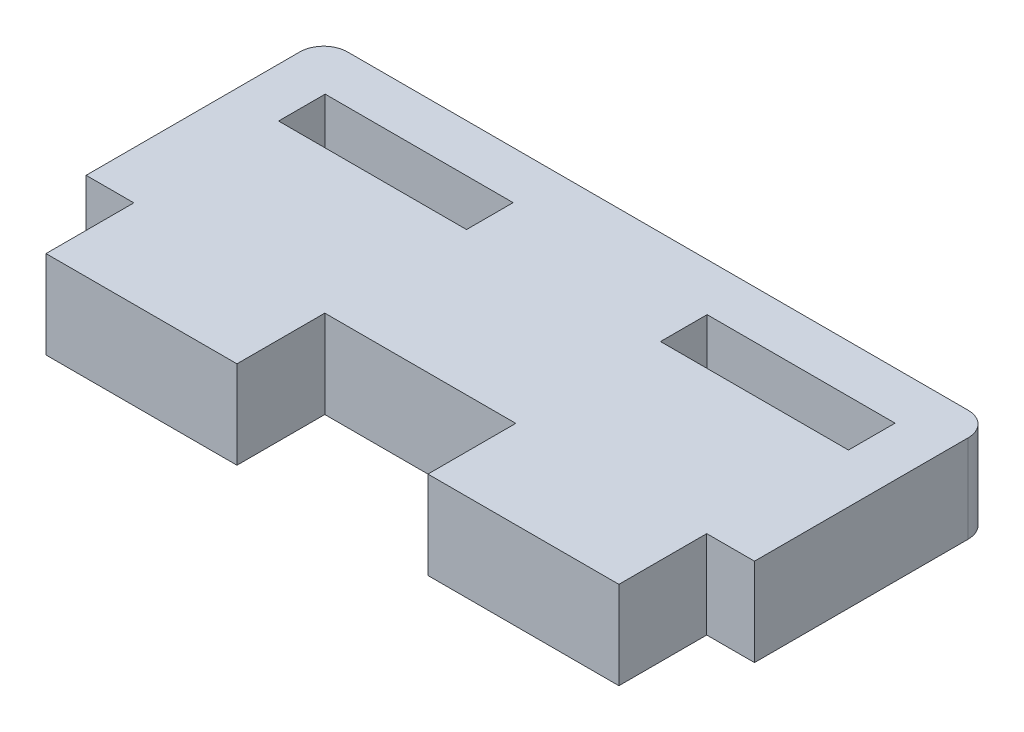
ISO-10303-21;
HEADER;
FILE_DESCRIPTION(('STEP AP214'),'2;1');
FILE_NAME('part.step','',(''),(''),'','','');
FILE_SCHEMA(('AUTOMOTIVE_DESIGN { 1 0 10303 214 1 1 1 1 }'));
ENDSEC;
DATA;
#1=APPLICATION_CONTEXT('core data for automotive mechanical design processes');
#2=APPLICATION_PROTOCOL_DEFINITION('international standard','automotive_design',2000,#1);
#3=PRODUCT_CONTEXT('',#1,'mechanical');
#4=PRODUCT('Part','Part','',(#3));
#5=PRODUCT_RELATED_PRODUCT_CATEGORY('part','',(#4));
#6=PRODUCT_DEFINITION_FORMATION('','',#4);
#7=PRODUCT_DEFINITION_CONTEXT('part definition',#1,'design');
#8=PRODUCT_DEFINITION('design','',#6,#7);
#9=PRODUCT_DEFINITION_SHAPE('','',#8);
#10=(LENGTH_UNIT() NAMED_UNIT(*) SI_UNIT(.MILLI.,.METRE.));
#11=(NAMED_UNIT(*) PLANE_ANGLE_UNIT() SI_UNIT($,.RADIAN.));
#12=(NAMED_UNIT(*) SI_UNIT($,.STERADIAN.) SOLID_ANGLE_UNIT());
#13=UNCERTAINTY_MEASURE_WITH_UNIT(LENGTH_MEASURE(1.E-05),#10,'distance_accuracy_value','');
#14=(GEOMETRIC_REPRESENTATION_CONTEXT(3) GLOBAL_UNCERTAINTY_ASSIGNED_CONTEXT((#13)) GLOBAL_UNIT_ASSIGNED_CONTEXT((#10,
#11,#12)) REPRESENTATION_CONTEXT('',''));
#15=CARTESIAN_POINT('',(0.,0.,0.));
#16=DIRECTION('',(0.,0.,1.));
#17=DIRECTION('',(1.,0.,0.));
#18=AXIS2_PLACEMENT_3D('',#15,#16,#17);
#19=CARTESIAN_POINT('',(0.,5.842,0.));
#20=DIRECTION('',(0.,1.,0.));
#21=DIRECTION('',(0.,0.,1.));
#22=AXIS2_PLACEMENT_3D('',#19,#20,#21);
#23=PLANE('',#22);
#24=DIRECTION('',(0.,0.,-1.));
#25=VECTOR('',#24,1.);
#26=CARTESIAN_POINT('',(22.225,5.842,4.7625));
#27=LINE('',#26,#25);
#28=CARTESIAN_POINT('',(22.225,5.842,4.7625));
#29=VERTEX_POINT('',#28);
#30=CARTESIAN_POINT('',(22.225,5.842,-9.4488));
#31=VERTEX_POINT('',#30);
#32=EDGE_CURVE('E281',#29,#31,#27,.T.);
#33=ORIENTED_EDGE('',*,*,#32,.T.);
#34=CARTESIAN_POINT('',(20.6375,5.842,-9.44880000000001));
#35=DIRECTION('',(0.,1.,0.));
#36=DIRECTION('',(0.,0.,1.));
#37=AXIS2_PLACEMENT_3D('',#34,#35,#36);
#38=CIRCLE('',#37,1.5875);
#39=CARTESIAN_POINT('',(20.6375,5.842,-11.0363));
#40=VERTEX_POINT('',#39);
#41=EDGE_CURVE('E43',#31,#40,#38,.T.);
#42=ORIENTED_EDGE('',*,*,#41,.T.);
#43=DIRECTION('',(-1.,0.,0.));
#44=VECTOR('',#43,1.);
#45=CARTESIAN_POINT('',(22.225,5.842,-11.0363));
#46=LINE('',#45,#44);
#47=CARTESIAN_POINT('',(-20.6375,5.842,-11.0363));
#48=VERTEX_POINT('',#47);
#49=EDGE_CURVE('E283',#40,#48,#46,.T.);
#50=ORIENTED_EDGE('',*,*,#49,.T.);
#51=CARTESIAN_POINT('',(-20.6375,5.842,-9.4488));
#52=DIRECTION('',(0.,1.,0.));
#53=DIRECTION('',(0.,0.,1.));
#54=AXIS2_PLACEMENT_3D('',#51,#52,#53);
#55=CIRCLE('',#54,1.5875);
#56=CARTESIAN_POINT('',(-22.225,5.842,-9.4488));
#57=VERTEX_POINT('',#56);
#58=EDGE_CURVE('E50',#48,#57,#55,.T.);
#59=ORIENTED_EDGE('',*,*,#58,.T.);
#60=DIRECTION('',(0.,0.,1.));
#61=VECTOR('',#60,1.);
#62=CARTESIAN_POINT('',(-22.225,5.842,-4.7625));
#63=LINE('',#62,#61);
#64=CARTESIAN_POINT('',(-22.225,5.842,4.7625));
#65=VERTEX_POINT('',#64);
#66=EDGE_CURVE('E260',#57,#65,#63,.T.);
#67=ORIENTED_EDGE('',*,*,#66,.T.);
#68=DIRECTION('',(1.,0.,0.));
#69=VECTOR('',#68,1.);
#70=CARTESIAN_POINT('',(-19.05,5.842,4.7625));
#71=LINE('',#70,#69);
#72=CARTESIAN_POINT('',(-19.05,5.842,4.7625));
#73=VERTEX_POINT('',#72);
#74=EDGE_CURVE('E262',#65,#73,#71,.T.);
#75=ORIENTED_EDGE('',*,*,#74,.T.);
#76=DIRECTION('',(0.,0.,1.));
#77=VECTOR('',#76,1.);
#78=CARTESIAN_POINT('',(-19.05,5.842,10.6045));
#79=LINE('',#78,#77);
#80=CARTESIAN_POINT('',(-19.05,5.842,10.6045));
#81=VERTEX_POINT('',#80);
#82=EDGE_CURVE('E265',#73,#81,#79,.T.);
#83=ORIENTED_EDGE('',*,*,#82,.T.);
#84=DIRECTION('',(1.,0.,0.));
#85=VECTOR('',#84,1.);
#86=CARTESIAN_POINT('',(-6.35,5.842,10.6045));
#87=LINE('',#86,#85);
#88=CARTESIAN_POINT('',(-6.35,5.842,10.6045));
#89=VERTEX_POINT('',#88);
#90=EDGE_CURVE('E267',#81,#89,#87,.T.);
#91=ORIENTED_EDGE('',*,*,#90,.T.);
#92=DIRECTION('',(0.,0.,-1.));
#93=VECTOR('',#92,1.);
#94=CARTESIAN_POINT('',(-6.35,5.842,10.6045));
#95=LINE('',#94,#93);
#96=CARTESIAN_POINT('',(-6.35,5.842,4.7625));
#97=VERTEX_POINT('',#96);
#98=EDGE_CURVE('E269',#89,#97,#95,.T.);
#99=ORIENTED_EDGE('',*,*,#98,.T.);
#100=DIRECTION('',(1.,0.,0.));
#101=VECTOR('',#100,1.);
#102=CARTESIAN_POINT('',(6.35,5.842,4.7625));
#103=LINE('',#102,#101);
#104=CARTESIAN_POINT('',(6.35,5.842,4.7625));
#105=VERTEX_POINT('',#104);
#106=EDGE_CURVE('E271',#97,#105,#103,.T.);
#107=ORIENTED_EDGE('',*,*,#106,.T.);
#108=DIRECTION('',(0.,0.,1.));
#109=VECTOR('',#108,1.);
#110=CARTESIAN_POINT('',(6.35,5.842,10.6045));
#111=LINE('',#110,#109);
#112=CARTESIAN_POINT('',(6.35,5.842,10.6045));
#113=VERTEX_POINT('',#112);
#114=EDGE_CURVE('E273',#105,#113,#111,.T.);
#115=ORIENTED_EDGE('',*,*,#114,.T.);
#116=DIRECTION('',(1.,0.,0.));
#117=VECTOR('',#116,1.);
#118=CARTESIAN_POINT('',(6.35,5.842,10.6045));
#119=LINE('',#118,#117);
#120=CARTESIAN_POINT('',(19.05,5.842,10.6045));
#121=VERTEX_POINT('',#120);
#122=EDGE_CURVE('E275',#113,#121,#119,.T.);
#123=ORIENTED_EDGE('',*,*,#122,.T.);
#124=DIRECTION('',(0.,0.,-1.));
#125=VECTOR('',#124,1.);
#126=CARTESIAN_POINT('',(19.05,5.842,10.6045));
#127=LINE('',#126,#125);
#128=CARTESIAN_POINT('',(19.05,5.842,4.7625));
#129=VERTEX_POINT('',#128);
#130=EDGE_CURVE('E277',#121,#129,#127,.T.);
#131=ORIENTED_EDGE('',*,*,#130,.T.);
#132=DIRECTION('',(1.,0.,0.));
#133=VECTOR('',#132,1.);
#134=CARTESIAN_POINT('',(22.225,5.842,4.7625));
#135=LINE('',#134,#133);
#136=EDGE_CURVE('E279',#129,#29,#135,.T.);
#137=ORIENTED_EDGE('',*,*,#136,.T.);
#138=EDGE_LOOP('',(#33,#42,#50,#59,#67,#75,#83,#91,#99,#107,#115,#123,#131,#137));
#139=FACE_BOUND('',#138,.T.);
#140=DIRECTION('',(0.,0.,-1.));
#141=VECTOR('',#140,1.);
#142=CARTESIAN_POINT('',(-6.45,5.842,-7.8613));
#143=LINE('',#142,#141);
#144=CARTESIAN_POINT('',(-6.45,5.842,-4.7625));
#145=VERTEX_POINT('',#144);
#146=CARTESIAN_POINT('',(-6.45,5.842,-7.8613));
#147=VERTEX_POINT('',#146);
#148=EDGE_CURVE('E231',#145,#147,#143,.T.);
#149=ORIENTED_EDGE('',*,*,#148,.F.);
#150=DIRECTION('',(1.,0.,0.));
#151=VECTOR('',#150,1.);
#152=CARTESIAN_POINT('',(-6.45,5.842,-4.7625));
#153=LINE('',#152,#151);
#154=CARTESIAN_POINT('',(-18.95,5.842,-4.7625));
#155=VERTEX_POINT('',#154);
#156=EDGE_CURVE('E229',#155,#145,#153,.T.);
#157=ORIENTED_EDGE('',*,*,#156,.F.);
#158=DIRECTION('',(0.,0.,1.));
#159=VECTOR('',#158,1.);
#160=CARTESIAN_POINT('',(-18.95,5.842,-4.7625));
#161=LINE('',#160,#159);
#162=CARTESIAN_POINT('',(-18.95,5.842,-7.8613));
#163=VERTEX_POINT('',#162);
#164=EDGE_CURVE('E237',#163,#155,#161,.T.);
#165=ORIENTED_EDGE('',*,*,#164,.F.);
#166=DIRECTION('',(-1.,0.,0.));
#167=VECTOR('',#166,1.);
#168=CARTESIAN_POINT('',(-6.45,5.842,-7.8613));
#169=LINE('',#168,#167);
#170=EDGE_CURVE('E234',#147,#163,#169,.T.);
#171=ORIENTED_EDGE('',*,*,#170,.F.);
#172=EDGE_LOOP('',(#149,#157,#165,#171));
#173=FACE_BOUND('',#172,.T.);
#174=DIRECTION('',(0.,0.,1.));
#175=VECTOR('',#174,1.);
#176=CARTESIAN_POINT('',(6.45,5.842,-7.8613));
#177=LINE('',#176,#175);
#178=CARTESIAN_POINT('',(6.45,5.842,-7.8613));
#179=VERTEX_POINT('',#178);
#180=CARTESIAN_POINT('',(6.45,5.842,-4.7625));
#181=VERTEX_POINT('',#180);
#182=EDGE_CURVE('E198',#179,#181,#177,.T.);
#183=ORIENTED_EDGE('',*,*,#182,.F.);
#184=DIRECTION('',(-1.,0.,0.));
#185=VECTOR('',#184,1.);
#186=CARTESIAN_POINT('',(18.95,5.842,-7.8613));
#187=LINE('',#186,#185);
#188=CARTESIAN_POINT('',(18.95,5.842,-7.8613));
#189=VERTEX_POINT('',#188);
#190=EDGE_CURVE('E188',#189,#179,#187,.T.);
#191=ORIENTED_EDGE('',*,*,#190,.F.);
#192=DIRECTION('',(0.,0.,-1.));
#193=VECTOR('',#192,1.);
#194=CARTESIAN_POINT('',(18.95,5.842,-4.7625));
#195=LINE('',#194,#193);
#196=CARTESIAN_POINT('',(18.95,5.842,-4.7625));
#197=VERTEX_POINT('',#196);
#198=EDGE_CURVE('E213',#197,#189,#195,.T.);
#199=ORIENTED_EDGE('',*,*,#198,.F.);
#200=DIRECTION('',(1.,0.,0.));
#201=VECTOR('',#200,1.);
#202=CARTESIAN_POINT('',(18.95,5.842,-4.7625));
#203=LINE('',#202,#201);
#204=EDGE_CURVE('E211',#181,#197,#203,.T.);
#205=ORIENTED_EDGE('',*,*,#204,.F.);
#206=EDGE_LOOP('',(#183,#191,#199,#205));
#207=FACE_BOUND('',#206,.T.);
#208=ADVANCED_FACE('F35',(#139,#173,#207),#23,.T.);
#209=CARTESIAN_POINT('',(0.,0.,0.));
#210=DIRECTION('',(0.,1.,0.));
#211=DIRECTION('',(0.,0.,1.));
#212=AXIS2_PLACEMENT_3D('',#209,#210,#211);
#213=PLANE('',#212);
#214=DIRECTION('',(1.,0.,0.));
#215=VECTOR('',#214,1.);
#216=CARTESIAN_POINT('',(-6.45,0.,-4.7625));
#217=LINE('',#216,#215);
#218=CARTESIAN_POINT('',(-18.95,0.,-4.7625));
#219=VERTEX_POINT('',#218);
#220=CARTESIAN_POINT('',(-6.45,0.,-4.7625));
#221=VERTEX_POINT('',#220);
#222=EDGE_CURVE('E206',#219,#221,#217,.T.);
#223=ORIENTED_EDGE('',*,*,#222,.T.);
#224=DIRECTION('',(0.,0.,-1.));
#225=VECTOR('',#224,1.);
#226=CARTESIAN_POINT('',(-6.45,0.,-7.8613));
#227=LINE('',#226,#225);
#228=CARTESIAN_POINT('',(-6.45,0.,-7.8613));
#229=VERTEX_POINT('',#228);
#230=EDGE_CURVE('E242',#221,#229,#227,.T.);
#231=ORIENTED_EDGE('',*,*,#230,.T.);
#232=DIRECTION('',(-1.,0.,0.));
#233=VECTOR('',#232,1.);
#234=CARTESIAN_POINT('',(-6.45,0.,-7.8613));
#235=LINE('',#234,#233);
#236=CARTESIAN_POINT('',(-18.95,0.,-7.8613));
#237=VERTEX_POINT('',#236);
#238=EDGE_CURVE('E245',#229,#237,#235,.T.);
#239=ORIENTED_EDGE('',*,*,#238,.T.);
#240=DIRECTION('',(0.,0.,1.));
#241=VECTOR('',#240,1.);
#242=CARTESIAN_POINT('',(-18.95,0.,-4.7625));
#243=LINE('',#242,#241);
#244=EDGE_CURVE('E232',#237,#219,#243,.T.);
#245=ORIENTED_EDGE('',*,*,#244,.T.);
#246=EDGE_LOOP('',(#223,#231,#239,#245));
#247=FACE_BOUND('',#246,.T.);
#248=DIRECTION('',(-1.,0.,0.));
#249=VECTOR('',#248,1.);
#250=CARTESIAN_POINT('',(22.225,0.,-11.0363));
#251=LINE('',#250,#249);
#252=CARTESIAN_POINT('',(20.6375,0.,-11.0363));
#253=VERTEX_POINT('',#252);
#254=CARTESIAN_POINT('',(-20.6375,0.,-11.0363));
#255=VERTEX_POINT('',#254);
#256=EDGE_CURVE('E306',#253,#255,#251,.T.);
#257=ORIENTED_EDGE('',*,*,#256,.F.);
#258=CARTESIAN_POINT('',(20.6375,0.,-9.44880000000001));
#259=DIRECTION('',(0.,1.,0.));
#260=DIRECTION('',(0.,0.,1.));
#261=AXIS2_PLACEMENT_3D('',#258,#259,#260);
#262=CIRCLE('',#261,1.5875);
#263=CARTESIAN_POINT('',(22.225,0.,-9.44880000000001));
#264=VERTEX_POINT('',#263);
#265=EDGE_CURVE('E346',#253,#264,#262,.F.);
#266=ORIENTED_EDGE('',*,*,#265,.T.);
#267=DIRECTION('',(0.,0.,-1.));
#268=VECTOR('',#267,1.);
#269=CARTESIAN_POINT('',(22.225,0.,-11.0363));
#270=LINE('',#269,#268);
#271=CARTESIAN_POINT('',(22.225,0.,4.7625));
#272=VERTEX_POINT('',#271);
#273=EDGE_CURVE('E304',#272,#264,#270,.T.);
#274=ORIENTED_EDGE('',*,*,#273,.F.);
#275=DIRECTION('',(1.,0.,0.));
#276=VECTOR('',#275,1.);
#277=CARTESIAN_POINT('',(22.225,0.,4.7625));
#278=LINE('',#277,#276);
#279=CARTESIAN_POINT('',(19.05,0.,4.7625));
#280=VERTEX_POINT('',#279);
#281=EDGE_CURVE('E301',#280,#272,#278,.T.);
#282=ORIENTED_EDGE('',*,*,#281,.F.);
#283=DIRECTION('',(0.,0.,-1.));
#284=VECTOR('',#283,1.);
#285=CARTESIAN_POINT('',(19.05,0.,10.6045));
#286=LINE('',#285,#284);
#287=CARTESIAN_POINT('',(19.05,0.,10.6045));
#288=VERTEX_POINT('',#287);
#289=EDGE_CURVE('E299',#288,#280,#286,.T.);
#290=ORIENTED_EDGE('',*,*,#289,.F.);
#291=DIRECTION('',(1.,0.,0.));
#292=VECTOR('',#291,1.);
#293=CARTESIAN_POINT('',(6.35,0.,10.6045));
#294=LINE('',#293,#292);
#295=CARTESIAN_POINT('',(6.35,0.,10.6045));
#296=VERTEX_POINT('',#295);
#297=EDGE_CURVE('E297',#296,#288,#294,.T.);
#298=ORIENTED_EDGE('',*,*,#297,.F.);
#299=DIRECTION('',(0.,0.,1.));
#300=VECTOR('',#299,1.);
#301=CARTESIAN_POINT('',(6.35,0.,10.6045));
#302=LINE('',#301,#300);
#303=CARTESIAN_POINT('',(6.35,0.,4.7625));
#304=VERTEX_POINT('',#303);
#305=EDGE_CURVE('E295',#304,#296,#302,.T.);
#306=ORIENTED_EDGE('',*,*,#305,.F.);
#307=DIRECTION('',(1.,0.,0.));
#308=VECTOR('',#307,1.);
#309=CARTESIAN_POINT('',(6.35,0.,4.7625));
#310=LINE('',#309,#308);
#311=CARTESIAN_POINT('',(-6.35,0.,4.7625));
#312=VERTEX_POINT('',#311);
#313=EDGE_CURVE('E293',#312,#304,#310,.T.);
#314=ORIENTED_EDGE('',*,*,#313,.F.);
#315=DIRECTION('',(0.,0.,-1.));
#316=VECTOR('',#315,1.);
#317=CARTESIAN_POINT('',(-6.35,0.,10.6045));
#318=LINE('',#317,#316);
#319=CARTESIAN_POINT('',(-6.35,0.,10.6045));
#320=VERTEX_POINT('',#319);
#321=EDGE_CURVE('E291',#320,#312,#318,.T.);
#322=ORIENTED_EDGE('',*,*,#321,.F.);
#323=DIRECTION('',(1.,0.,0.));
#324=VECTOR('',#323,1.);
#325=CARTESIAN_POINT('',(-6.35,0.,10.6045));
#326=LINE('',#325,#324);
#327=CARTESIAN_POINT('',(-19.05,0.,10.6045));
#328=VERTEX_POINT('',#327);
#329=EDGE_CURVE('E289',#328,#320,#326,.T.);
#330=ORIENTED_EDGE('',*,*,#329,.F.);
#331=DIRECTION('',(0.,0.,1.));
#332=VECTOR('',#331,1.);
#333=CARTESIAN_POINT('',(-19.05,0.,10.6045));
#334=LINE('',#333,#332);
#335=CARTESIAN_POINT('',(-19.05,0.,4.7625));
#336=VERTEX_POINT('',#335);
#337=EDGE_CURVE('E287',#336,#328,#334,.T.);
#338=ORIENTED_EDGE('',*,*,#337,.F.);
#339=DIRECTION('',(1.,0.,0.));
#340=VECTOR('',#339,1.);
#341=CARTESIAN_POINT('',(-19.05,0.,4.7625));
#342=LINE('',#341,#340);
#343=CARTESIAN_POINT('',(-22.225,0.,4.7625));
#344=VERTEX_POINT('',#343);
#345=EDGE_CURVE('E259',#344,#336,#342,.T.);
#346=ORIENTED_EDGE('',*,*,#345,.F.);
#347=DIRECTION('',(0.,0.,1.));
#348=VECTOR('',#347,1.);
#349=CARTESIAN_POINT('',(-22.225,0.,-11.0363));
#350=LINE('',#349,#348);
#351=CARTESIAN_POINT('',(-22.225,0.,-9.4488));
#352=VERTEX_POINT('',#351);
#353=EDGE_CURVE('E263',#352,#344,#350,.T.);
#354=ORIENTED_EDGE('',*,*,#353,.F.);
#355=CARTESIAN_POINT('',(-20.6375,0.,-9.4488));
#356=DIRECTION('',(0.,1.,0.));
#357=DIRECTION('',(0.,0.,1.));
#358=AXIS2_PLACEMENT_3D('',#355,#356,#357);
#359=CIRCLE('',#358,1.5875);
#360=EDGE_CURVE('E344',#352,#255,#359,.F.);
#361=ORIENTED_EDGE('',*,*,#360,.T.);
#362=EDGE_LOOP('',(#257,#266,#274,#282,#290,#298,#306,#314,#322,#330,#338,#346,#354,#361));
#363=FACE_BOUND('',#362,.T.);
#364=DIRECTION('',(-1.,0.,0.));
#365=VECTOR('',#364,1.);
#366=CARTESIAN_POINT('',(18.95,0.,-7.8613));
#367=LINE('',#366,#365);
#368=CARTESIAN_POINT('',(18.95,0.,-7.8613));
#369=VERTEX_POINT('',#368);
#370=CARTESIAN_POINT('',(6.45,0.,-7.8613));
#371=VERTEX_POINT('',#370);
#372=EDGE_CURVE('E217',#369,#371,#367,.T.);
#373=ORIENTED_EDGE('',*,*,#372,.T.);
#374=DIRECTION('',(0.,0.,1.));
#375=VECTOR('',#374,1.);
#376=CARTESIAN_POINT('',(6.45,0.,-7.8613));
#377=LINE('',#376,#375);
#378=CARTESIAN_POINT('',(6.45,0.,-4.7625));
#379=VERTEX_POINT('',#378);
#380=EDGE_CURVE('E205',#371,#379,#377,.T.);
#381=ORIENTED_EDGE('',*,*,#380,.T.);
#382=DIRECTION('',(1.,0.,0.));
#383=VECTOR('',#382,1.);
#384=CARTESIAN_POINT('',(18.95,0.,-4.7625));
#385=LINE('',#384,#383);
#386=CARTESIAN_POINT('',(18.95,0.,-4.7625));
#387=VERTEX_POINT('',#386);
#388=EDGE_CURVE('E220',#379,#387,#385,.T.);
#389=ORIENTED_EDGE('',*,*,#388,.T.);
#390=DIRECTION('',(0.,0.,-1.));
#391=VECTOR('',#390,1.);
#392=CARTESIAN_POINT('',(18.95,0.,-4.7625));
#393=LINE('',#392,#391);
#394=EDGE_CURVE('E199',#387,#369,#393,.T.);
#395=ORIENTED_EDGE('',*,*,#394,.T.);
#396=EDGE_LOOP('',(#373,#381,#389,#395));
#397=FACE_BOUND('',#396,.T.);
#398=ADVANCED_FACE('F360',(#247,#363,#397),#213,.F.);
#399=CARTESIAN_POINT('',(-19.05,5.842,4.7625));
#400=DIRECTION('',(0.,0.,-1.));
#401=DIRECTION('',(-1.,0.,0.));
#402=AXIS2_PLACEMENT_3D('',#399,#400,#401);
#403=PLANE('',#402);
#404=ORIENTED_EDGE('',*,*,#345,.T.);
#405=DIRECTION('',(0.,-1.,0.));
#406=VECTOR('',#405,1.);
#407=CARTESIAN_POINT('',(-19.05,5.842,4.7625));
#408=LINE('',#407,#406);
#409=EDGE_CURVE('E333',#73,#336,#408,.T.);
#410=ORIENTED_EDGE('',*,*,#409,.F.);
#411=ORIENTED_EDGE('',*,*,#74,.F.);
#412=DIRECTION('',(0.,-1.,0.));
#413=VECTOR('',#412,1.);
#414=CARTESIAN_POINT('',(-22.225,5.842,4.7625));
#415=LINE('',#414,#413);
#416=EDGE_CURVE('E336',#65,#344,#415,.T.);
#417=ORIENTED_EDGE('',*,*,#416,.T.);
#418=EDGE_LOOP('',(#404,#410,#411,#417));
#419=FACE_BOUND('',#418,.T.);
#420=ADVANCED_FACE('F408',(#419),#403,.F.);
#421=CARTESIAN_POINT('',(-19.05,5.842,10.6045));
#422=DIRECTION('',(1.,0.,0.));
#423=DIRECTION('',(0.,0.,-1.));
#424=AXIS2_PLACEMENT_3D('',#421,#422,#423);
#425=PLANE('',#424);
#426=ORIENTED_EDGE('',*,*,#337,.T.);
#427=DIRECTION('',(0.,-1.,0.));
#428=VECTOR('',#427,1.);
#429=CARTESIAN_POINT('',(-19.05,5.842,10.6045));
#430=LINE('',#429,#428);
#431=EDGE_CURVE('E330',#81,#328,#430,.T.);
#432=ORIENTED_EDGE('',*,*,#431,.F.);
#433=ORIENTED_EDGE('',*,*,#82,.F.);
#434=ORIENTED_EDGE('',*,*,#409,.T.);
#435=EDGE_LOOP('',(#426,#432,#433,#434));
#436=FACE_BOUND('',#435,.T.);
#437=ADVANCED_FACE('F403',(#436),#425,.F.);
#438=CARTESIAN_POINT('',(-6.35,5.842,10.6045));
#439=DIRECTION('',(0.,0.,-1.));
#440=DIRECTION('',(-1.,0.,0.));
#441=AXIS2_PLACEMENT_3D('',#438,#439,#440);
#442=PLANE('',#441);
#443=ORIENTED_EDGE('',*,*,#329,.T.);
#444=DIRECTION('',(0.,-1.,0.));
#445=VECTOR('',#444,1.);
#446=CARTESIAN_POINT('',(-6.35,5.842,10.6045));
#447=LINE('',#446,#445);
#448=EDGE_CURVE('E327',#89,#320,#447,.T.);
#449=ORIENTED_EDGE('',*,*,#448,.F.);
#450=ORIENTED_EDGE('',*,*,#90,.F.);
#451=ORIENTED_EDGE('',*,*,#431,.T.);
#452=EDGE_LOOP('',(#443,#449,#450,#451));
#453=FACE_BOUND('',#452,.T.);
#454=ADVANCED_FACE('F397',(#453),#442,.F.);
#455=CARTESIAN_POINT('',(-6.35,5.842,10.6045));
#456=DIRECTION('',(-1.,0.,0.));
#457=DIRECTION('',(0.,0.,1.));
#458=AXIS2_PLACEMENT_3D('',#455,#456,#457);
#459=PLANE('',#458);
#460=ORIENTED_EDGE('',*,*,#321,.T.);
#461=DIRECTION('',(0.,-1.,0.));
#462=VECTOR('',#461,1.);
#463=CARTESIAN_POINT('',(-6.35,5.842,4.7625));
#464=LINE('',#463,#462);
#465=EDGE_CURVE('E324',#97,#312,#464,.T.);
#466=ORIENTED_EDGE('',*,*,#465,.F.);
#467=ORIENTED_EDGE('',*,*,#98,.F.);
#468=ORIENTED_EDGE('',*,*,#448,.T.);
#469=EDGE_LOOP('',(#460,#466,#467,#468));
#470=FACE_BOUND('',#469,.T.);
#471=ADVANCED_FACE('F393',(#470),#459,.F.);
#472=CARTESIAN_POINT('',(6.35,5.842,4.7625));
#473=DIRECTION('',(0.,0.,-1.));
#474=DIRECTION('',(-1.,0.,0.));
#475=AXIS2_PLACEMENT_3D('',#472,#473,#474);
#476=PLANE('',#475);
#477=ORIENTED_EDGE('',*,*,#313,.T.);
#478=DIRECTION('',(0.,-1.,0.));
#479=VECTOR('',#478,1.);
#480=CARTESIAN_POINT('',(6.35,5.842,4.7625));
#481=LINE('',#480,#479);
#482=EDGE_CURVE('E321',#105,#304,#481,.T.);
#483=ORIENTED_EDGE('',*,*,#482,.F.);
#484=ORIENTED_EDGE('',*,*,#106,.F.);
#485=ORIENTED_EDGE('',*,*,#465,.T.);
#486=EDGE_LOOP('',(#477,#483,#484,#485));
#487=FACE_BOUND('',#486,.T.);
#488=ADVANCED_FACE('F388',(#487),#476,.F.);
#489=CARTESIAN_POINT('',(6.35,5.842,10.6045));
#490=DIRECTION('',(1.,0.,0.));
#491=DIRECTION('',(0.,0.,-1.));
#492=AXIS2_PLACEMENT_3D('',#489,#490,#491);
#493=PLANE('',#492);
#494=ORIENTED_EDGE('',*,*,#305,.T.);
#495=DIRECTION('',(0.,-1.,0.));
#496=VECTOR('',#495,1.);
#497=CARTESIAN_POINT('',(6.35,5.842,10.6045));
#498=LINE('',#497,#496);
#499=EDGE_CURVE('E318',#113,#296,#498,.T.);
#500=ORIENTED_EDGE('',*,*,#499,.F.);
#501=ORIENTED_EDGE('',*,*,#114,.F.);
#502=ORIENTED_EDGE('',*,*,#482,.T.);
#503=EDGE_LOOP('',(#494,#500,#501,#502));
#504=FACE_BOUND('',#503,.T.);
#505=ADVANCED_FACE('F382',(#504),#493,.F.);
#506=CARTESIAN_POINT('',(6.35,5.842,10.6045));
#507=DIRECTION('',(0.,0.,-1.));
#508=DIRECTION('',(-1.,0.,0.));
#509=AXIS2_PLACEMENT_3D('',#506,#507,#508);
#510=PLANE('',#509);
#511=ORIENTED_EDGE('',*,*,#297,.T.);
#512=DIRECTION('',(0.,-1.,0.));
#513=VECTOR('',#512,1.);
#514=CARTESIAN_POINT('',(19.05,5.842,10.6045));
#515=LINE('',#514,#513);
#516=EDGE_CURVE('E315',#121,#288,#515,.T.);
#517=ORIENTED_EDGE('',*,*,#516,.F.);
#518=ORIENTED_EDGE('',*,*,#122,.F.);
#519=ORIENTED_EDGE('',*,*,#499,.T.);
#520=EDGE_LOOP('',(#511,#517,#518,#519));
#521=FACE_BOUND('',#520,.T.);
#522=ADVANCED_FACE('F378',(#521),#510,.F.);
#523=CARTESIAN_POINT('',(19.05,5.842,10.6045));
#524=DIRECTION('',(-1.,0.,0.));
#525=DIRECTION('',(0.,0.,1.));
#526=AXIS2_PLACEMENT_3D('',#523,#524,#525);
#527=PLANE('',#526);
#528=ORIENTED_EDGE('',*,*,#289,.T.);
#529=DIRECTION('',(0.,-1.,0.));
#530=VECTOR('',#529,1.);
#531=CARTESIAN_POINT('',(19.05,5.842,4.7625));
#532=LINE('',#531,#530);
#533=EDGE_CURVE('E312',#129,#280,#532,.T.);
#534=ORIENTED_EDGE('',*,*,#533,.F.);
#535=ORIENTED_EDGE('',*,*,#130,.F.);
#536=ORIENTED_EDGE('',*,*,#516,.T.);
#537=EDGE_LOOP('',(#528,#534,#535,#536));
#538=FACE_BOUND('',#537,.T.);
#539=ADVANCED_FACE('F373',(#538),#527,.F.);
#540=CARTESIAN_POINT('',(22.225,5.842,4.7625));
#541=DIRECTION('',(0.,0.,-1.));
#542=DIRECTION('',(-1.,0.,0.));
#543=AXIS2_PLACEMENT_3D('',#540,#541,#542);
#544=PLANE('',#543);
#545=ORIENTED_EDGE('',*,*,#281,.T.);
#546=DIRECTION('',(0.,-1.,0.));
#547=VECTOR('',#546,1.);
#548=CARTESIAN_POINT('',(22.225,5.842,4.7625));
#549=LINE('',#548,#547);
#550=EDGE_CURVE('E285',#29,#272,#549,.T.);
#551=ORIENTED_EDGE('',*,*,#550,.F.);
#552=ORIENTED_EDGE('',*,*,#136,.F.);
#553=ORIENTED_EDGE('',*,*,#533,.T.);
#554=EDGE_LOOP('',(#545,#551,#552,#553));
#555=FACE_BOUND('',#554,.T.);
#556=ADVANCED_FACE('F367',(#555),#544,.F.);
#557=CARTESIAN_POINT('',(22.225,5.842,-11.0363));
#558=DIRECTION('',(-1.,0.,0.));
#559=DIRECTION('',(0.,0.,1.));
#560=AXIS2_PLACEMENT_3D('',#557,#558,#559);
#561=PLANE('',#560);
#562=ORIENTED_EDGE('',*,*,#273,.T.);
#563=DIRECTION('',(0.,-1.,0.));
#564=VECTOR('',#563,1.);
#565=CARTESIAN_POINT('',(22.225,5.842,-9.44880000000001));
#566=LINE('',#565,#564);
#567=EDGE_CURVE('E58',#264,#31,#566,.F.);
#568=ORIENTED_EDGE('',*,*,#567,.T.);
#569=ORIENTED_EDGE('',*,*,#32,.F.);
#570=ORIENTED_EDGE('',*,*,#550,.T.);
#571=EDGE_LOOP('',(#562,#568,#569,#570));
#572=FACE_BOUND('',#571,.T.);
#573=ADVANCED_FACE('F363',(#572),#561,.F.);
#574=CARTESIAN_POINT('',(22.225,5.842,-11.0363));
#575=DIRECTION('',(0.,0.,1.));
#576=DIRECTION('',(1.,0.,0.));
#577=AXIS2_PLACEMENT_3D('',#574,#575,#576);
#578=PLANE('',#577);
#579=ORIENTED_EDGE('',*,*,#49,.F.);
#580=DIRECTION('',(0.,-1.,0.));
#581=VECTOR('',#580,1.);
#582=CARTESIAN_POINT('',(20.6375,5.842,-11.0363));
#583=LINE('',#582,#581);
#584=EDGE_CURVE('E341',#40,#253,#583,.T.);
#585=ORIENTED_EDGE('',*,*,#584,.T.);
#586=ORIENTED_EDGE('',*,*,#256,.T.);
#587=DIRECTION('',(0.,-1.,0.));
#588=VECTOR('',#587,1.);
#589=CARTESIAN_POINT('',(-20.6375,5.842,-11.0363));
#590=LINE('',#589,#588);
#591=EDGE_CURVE('E339',#255,#48,#590,.F.);
#592=ORIENTED_EDGE('',*,*,#591,.T.);
#593=EDGE_LOOP('',(#579,#585,#586,#592));
#594=FACE_BOUND('',#593,.T.);
#595=ADVANCED_FACE('F355',(#594),#578,.F.);
#596=CARTESIAN_POINT('',(-22.225,5.842,-11.0363));
#597=DIRECTION('',(1.,0.,0.));
#598=DIRECTION('',(0.,0.,-1.));
#599=AXIS2_PLACEMENT_3D('',#596,#597,#598);
#600=PLANE('',#599);
#601=ORIENTED_EDGE('',*,*,#66,.F.);
#602=DIRECTION('',(0.,-1.,0.));
#603=VECTOR('',#602,1.);
#604=CARTESIAN_POINT('',(-22.225,5.842,-9.4488));
#605=LINE('',#604,#603);
#606=EDGE_CURVE('E11',#57,#352,#605,.T.);
#607=ORIENTED_EDGE('',*,*,#606,.T.);
#608=ORIENTED_EDGE('',*,*,#353,.T.);
#609=ORIENTED_EDGE('',*,*,#416,.F.);
#610=EDGE_LOOP('',(#601,#607,#608,#609));
#611=FACE_BOUND('',#610,.T.);
#612=ADVANCED_FACE('F411',(#611),#600,.F.);
#613=CARTESIAN_POINT('',(-6.45,5.842,-4.7625));
#614=DIRECTION('',(0.,0.,-1.));
#615=DIRECTION('',(-1.,0.,0.));
#616=AXIS2_PLACEMENT_3D('',#613,#614,#615);
#617=PLANE('',#616);
#618=ORIENTED_EDGE('',*,*,#222,.F.);
#619=DIRECTION('',(0.,-1.,0.));
#620=VECTOR('',#619,1.);
#621=CARTESIAN_POINT('',(-18.95,5.842,-4.7625));
#622=LINE('',#621,#620);
#623=EDGE_CURVE('E239',#155,#219,#622,.T.);
#624=ORIENTED_EDGE('',*,*,#623,.F.);
#625=ORIENTED_EDGE('',*,*,#156,.T.);
#626=DIRECTION('',(0.,-1.,0.));
#627=VECTOR('',#626,1.);
#628=CARTESIAN_POINT('',(-6.45,5.842,-4.7625));
#629=LINE('',#628,#627);
#630=EDGE_CURVE('E256',#145,#221,#629,.T.);
#631=ORIENTED_EDGE('',*,*,#630,.T.);
#632=EDGE_LOOP('',(#618,#624,#625,#631));
#633=FACE_BOUND('',#632,.T.);
#634=ADVANCED_FACE('F427',(#633),#617,.T.);
#635=CARTESIAN_POINT('',(-6.45,5.842,-7.8613));
#636=DIRECTION('',(-1.,0.,0.));
#637=DIRECTION('',(0.,0.,1.));
#638=AXIS2_PLACEMENT_3D('',#635,#636,#637);
#639=PLANE('',#638);
#640=ORIENTED_EDGE('',*,*,#230,.F.);
#641=ORIENTED_EDGE('',*,*,#630,.F.);
#642=ORIENTED_EDGE('',*,*,#148,.T.);
#643=DIRECTION('',(0.,-1.,0.));
#644=VECTOR('',#643,1.);
#645=CARTESIAN_POINT('',(-6.45,5.842,-7.8613));
#646=LINE('',#645,#644);
#647=EDGE_CURVE('E254',#147,#229,#646,.T.);
#648=ORIENTED_EDGE('',*,*,#647,.T.);
#649=EDGE_LOOP('',(#640,#641,#642,#648));
#650=FACE_BOUND('',#649,.T.);
#651=ADVANCED_FACE('F521',(#650),#639,.T.);
#652=CARTESIAN_POINT('',(-6.45,5.842,-7.8613));
#653=DIRECTION('',(0.,0.,1.));
#654=DIRECTION('',(1.,0.,0.));
#655=AXIS2_PLACEMENT_3D('',#652,#653,#654);
#656=PLANE('',#655);
#657=ORIENTED_EDGE('',*,*,#238,.F.);
#658=ORIENTED_EDGE('',*,*,#647,.F.);
#659=ORIENTED_EDGE('',*,*,#170,.T.);
#660=DIRECTION('',(0.,-1.,0.));
#661=VECTOR('',#660,1.);
#662=CARTESIAN_POINT('',(-18.95,5.842,-7.8613));
#663=LINE('',#662,#661);
#664=EDGE_CURVE('E252',#163,#237,#663,.T.);
#665=ORIENTED_EDGE('',*,*,#664,.T.);
#666=EDGE_LOOP('',(#657,#658,#659,#665));
#667=FACE_BOUND('',#666,.T.);
#668=ADVANCED_FACE('F527',(#667),#656,.T.);
#669=CARTESIAN_POINT('',(-18.95,5.842,-4.7625));
#670=DIRECTION('',(1.,0.,0.));
#671=DIRECTION('',(0.,0.,-1.));
#672=AXIS2_PLACEMENT_3D('',#669,#670,#671);
#673=PLANE('',#672);
#674=ORIENTED_EDGE('',*,*,#244,.F.);
#675=ORIENTED_EDGE('',*,*,#664,.F.);
#676=ORIENTED_EDGE('',*,*,#164,.T.);
#677=ORIENTED_EDGE('',*,*,#623,.T.);
#678=EDGE_LOOP('',(#674,#675,#676,#677));
#679=FACE_BOUND('',#678,.T.);
#680=ADVANCED_FACE('F534',(#679),#673,.T.);
#681=CARTESIAN_POINT('',(18.95,5.842,-7.8613));
#682=DIRECTION('',(0.,0.,1.));
#683=DIRECTION('',(1.,0.,0.));
#684=AXIS2_PLACEMENT_3D('',#681,#682,#683);
#685=PLANE('',#684);
#686=ORIENTED_EDGE('',*,*,#372,.F.);
#687=DIRECTION('',(0.,-1.,0.));
#688=VECTOR('',#687,1.);
#689=CARTESIAN_POINT('',(18.95,5.842,-7.8613));
#690=LINE('',#689,#688);
#691=EDGE_CURVE('E194',#189,#369,#690,.T.);
#692=ORIENTED_EDGE('',*,*,#691,.F.);
#693=ORIENTED_EDGE('',*,*,#190,.T.);
#694=DIRECTION('',(0.,-1.,0.));
#695=VECTOR('',#694,1.);
#696=CARTESIAN_POINT('',(6.45,5.842,-7.8613));
#697=LINE('',#696,#695);
#698=EDGE_CURVE('E191',#179,#371,#697,.T.);
#699=ORIENTED_EDGE('',*,*,#698,.T.);
#700=EDGE_LOOP('',(#686,#692,#693,#699));
#701=FACE_BOUND('',#700,.T.);
#702=ADVANCED_FACE('F190',(#701),#685,.T.);
#703=CARTESIAN_POINT('',(6.45,5.842,-7.8613));
#704=DIRECTION('',(1.,0.,0.));
#705=DIRECTION('',(0.,0.,-1.));
#706=AXIS2_PLACEMENT_3D('',#703,#704,#705);
#707=PLANE('',#706);
#708=ORIENTED_EDGE('',*,*,#380,.F.);
#709=ORIENTED_EDGE('',*,*,#698,.F.);
#710=ORIENTED_EDGE('',*,*,#182,.T.);
#711=DIRECTION('',(0.,-1.,0.));
#712=VECTOR('',#711,1.);
#713=CARTESIAN_POINT('',(6.45,5.842,-4.7625));
#714=LINE('',#713,#712);
#715=EDGE_CURVE('E207',#181,#379,#714,.T.);
#716=ORIENTED_EDGE('',*,*,#715,.T.);
#717=EDGE_LOOP('',(#708,#709,#710,#716));
#718=FACE_BOUND('',#717,.T.);
#719=ADVANCED_FACE('F202',(#718),#707,.T.);
#720=CARTESIAN_POINT('',(18.95,5.842,-4.7625));
#721=DIRECTION('',(0.,0.,-1.));
#722=DIRECTION('',(-1.,0.,0.));
#723=AXIS2_PLACEMENT_3D('',#720,#721,#722);
#724=PLANE('',#723);
#725=ORIENTED_EDGE('',*,*,#388,.F.);
#726=ORIENTED_EDGE('',*,*,#715,.F.);
#727=ORIENTED_EDGE('',*,*,#204,.T.);
#728=DIRECTION('',(0.,-1.,0.));
#729=VECTOR('',#728,1.);
#730=CARTESIAN_POINT('',(18.95,5.842,-4.7625));
#731=LINE('',#730,#729);
#732=EDGE_CURVE('E226',#197,#387,#731,.T.);
#733=ORIENTED_EDGE('',*,*,#732,.T.);
#734=EDGE_LOOP('',(#725,#726,#727,#733));
#735=FACE_BOUND('',#734,.T.);
#736=ADVANCED_FACE('F555',(#735),#724,.T.);
#737=CARTESIAN_POINT('',(18.95,5.842,-4.7625));
#738=DIRECTION('',(-1.,0.,0.));
#739=DIRECTION('',(0.,0.,1.));
#740=AXIS2_PLACEMENT_3D('',#737,#738,#739);
#741=PLANE('',#740);
#742=ORIENTED_EDGE('',*,*,#394,.F.);
#743=ORIENTED_EDGE('',*,*,#732,.F.);
#744=ORIENTED_EDGE('',*,*,#198,.T.);
#745=ORIENTED_EDGE('',*,*,#691,.T.);
#746=EDGE_LOOP('',(#742,#743,#744,#745));
#747=FACE_BOUND('',#746,.T.);
#748=ADVANCED_FACE('F418',(#747),#741,.T.);
#749=CARTESIAN_POINT('',(20.6375,5.842,-9.44880000000001));
#750=DIRECTION('',(0.,-1.,0.));
#751=DIRECTION('',(0.,0.,-1.));
#752=AXIS2_PLACEMENT_3D('',#749,#750,#751);
#753=CYLINDRICAL_SURFACE('',#752,1.5875);
#754=ORIENTED_EDGE('',*,*,#41,.F.);
#755=ORIENTED_EDGE('',*,*,#567,.F.);
#756=ORIENTED_EDGE('',*,*,#265,.F.);
#757=ORIENTED_EDGE('',*,*,#584,.F.);
#758=EDGE_LOOP('',(#754,#755,#756,#757));
#759=FACE_BOUND('',#758,.T.);
#760=ADVANCED_FACE('F358',(#759),#753,.T.);
#761=CARTESIAN_POINT('',(-20.6375,5.842,-9.4488));
#762=DIRECTION('',(0.,-1.,0.));
#763=DIRECTION('',(0.,0.,-1.));
#764=AXIS2_PLACEMENT_3D('',#761,#762,#763);
#765=CYLINDRICAL_SURFACE('',#764,1.5875);
#766=ORIENTED_EDGE('',*,*,#58,.F.);
#767=ORIENTED_EDGE('',*,*,#591,.F.);
#768=ORIENTED_EDGE('',*,*,#360,.F.);
#769=ORIENTED_EDGE('',*,*,#606,.F.);
#770=EDGE_LOOP('',(#766,#767,#768,#769));
#771=FACE_BOUND('',#770,.T.);
#772=ADVANCED_FACE('F37',(#771),#765,.T.);
#773=CLOSED_SHELL('',(#208,#398,#420,#437,#454,#471,#488,#505,#522,#539,#556,#573,#595,#612,
#634,#651,#668,#680,#702,#719,#736,#748,#760,#772));
#774=MANIFOLD_SOLID_BREP('B2',#773);
#775=ADVANCED_BREP_SHAPE_REPRESENTATION('',(#18,#774),#14);
#776=SHAPE_DEFINITION_REPRESENTATION(#9,#775);
ENDSEC;
END-ISO-10303-21;
